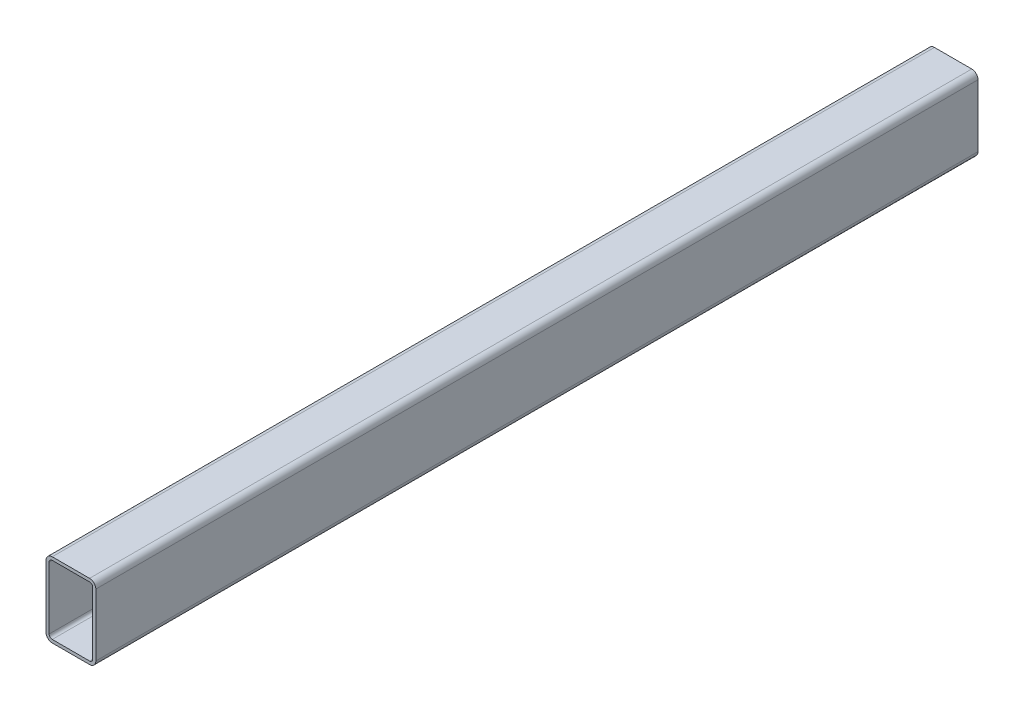
ISO-10303-21;
HEADER;
FILE_DESCRIPTION(('STEP AP214'),'2;1');
FILE_NAME('part.step','',(''),(''),'','','');
FILE_SCHEMA(('AUTOMOTIVE_DESIGN { 1 0 10303 214 1 1 1 1 }'));
ENDSEC;
DATA;
#1=APPLICATION_CONTEXT('core data for automotive mechanical design processes');
#2=APPLICATION_PROTOCOL_DEFINITION('international standard','automotive_design',2000,#1);
#3=PRODUCT_CONTEXT('',#1,'mechanical');
#4=PRODUCT('Part','Part','',(#3));
#5=PRODUCT_RELATED_PRODUCT_CATEGORY('part','',(#4));
#6=PRODUCT_DEFINITION_FORMATION('','',#4);
#7=PRODUCT_DEFINITION_CONTEXT('part definition',#1,'design');
#8=PRODUCT_DEFINITION('design','',#6,#7);
#9=PRODUCT_DEFINITION_SHAPE('','',#8);
#10=(LENGTH_UNIT() NAMED_UNIT(*) SI_UNIT(.MILLI.,.METRE.));
#11=(NAMED_UNIT(*) PLANE_ANGLE_UNIT() SI_UNIT($,.RADIAN.));
#12=(NAMED_UNIT(*) SI_UNIT($,.STERADIAN.) SOLID_ANGLE_UNIT());
#13=UNCERTAINTY_MEASURE_WITH_UNIT(LENGTH_MEASURE(1.E-05),#10,'distance_accuracy_value','');
#14=(GEOMETRIC_REPRESENTATION_CONTEXT(3) GLOBAL_UNCERTAINTY_ASSIGNED_CONTEXT((#13)) GLOBAL_UNIT_ASSIGNED_CONTEXT((#10,
#11,#12)) REPRESENTATION_CONTEXT('',''));
#15=CARTESIAN_POINT('',(0.,0.,0.));
#16=DIRECTION('',(0.,0.,1.));
#17=DIRECTION('',(1.,0.,0.));
#18=AXIS2_PLACEMENT_3D('',#15,#16,#17);
#19=CARTESIAN_POINT('',(-19.05,-31.75,-450.));
#20=DIRECTION('',(0.,0.,1.));
#21=DIRECTION('',(1.,0.,0.));
#22=AXIS2_PLACEMENT_3D('',#19,#20,#21);
#23=CYLINDRICAL_SURFACE('',#22,3.175);
#24=CARTESIAN_POINT('',(-19.05,-31.75,450.));
#25=DIRECTION('',(0.,0.,-1.));
#26=DIRECTION('',(-1.,0.,0.));
#27=AXIS2_PLACEMENT_3D('',#24,#25,#26);
#28=CIRCLE('',#27,3.175);
#29=CARTESIAN_POINT('',(-19.05,-34.925,450.));
#30=VERTEX_POINT('',#29);
#31=CARTESIAN_POINT('',(-22.2249999999999,-31.75,450.));
#32=VERTEX_POINT('',#31);
#33=EDGE_CURVE('E239',#30,#32,#28,.T.);
#34=ORIENTED_EDGE('',*,*,#33,.F.);
#35=DIRECTION('',(0.,0.,1.));
#36=VECTOR('',#35,1.);
#37=CARTESIAN_POINT('',(-19.05,-34.925,-450.));
#38=LINE('',#37,#36);
#39=CARTESIAN_POINT('',(-19.05,-34.925,-450.));
#40=VERTEX_POINT('',#39);
#41=EDGE_CURVE('E14',#40,#30,#38,.T.);
#42=ORIENTED_EDGE('',*,*,#41,.F.);
#43=CARTESIAN_POINT('',(-19.05,-31.75,-450.));
#44=DIRECTION('',(0.,0.,-1.));
#45=DIRECTION('',(-1.,0.,0.));
#46=AXIS2_PLACEMENT_3D('',#43,#44,#45);
#47=CIRCLE('',#46,3.175);
#48=CARTESIAN_POINT('',(-22.2249999999999,-31.75,-450.));
#49=VERTEX_POINT('',#48);
#50=EDGE_CURVE('E324',#40,#49,#47,.T.);
#51=ORIENTED_EDGE('',*,*,#50,.T.);
#52=DIRECTION('',(0.,0.,1.));
#53=VECTOR('',#52,1.);
#54=CARTESIAN_POINT('',(-22.2249999999999,-31.75,-450.));
#55=LINE('',#54,#53);
#56=EDGE_CURVE('E91',#49,#32,#55,.T.);
#57=ORIENTED_EDGE('',*,*,#56,.T.);
#58=EDGE_LOOP('',(#34,#42,#51,#57));
#59=FACE_BOUND('',#58,.T.);
#60=ADVANCED_FACE('F72',(#59),#23,.F.);
#61=CARTESIAN_POINT('',(-19.05,-34.925,-450.));
#62=DIRECTION('',(0.,1.,0.));
#63=DIRECTION('',(0.,0.,1.));
#64=AXIS2_PLACEMENT_3D('',#61,#62,#63);
#65=PLANE('',#64);
#66=DIRECTION('',(-1.,0.,0.));
#67=VECTOR('',#66,1.);
#68=CARTESIAN_POINT('',(-19.05,-34.925,450.));
#69=LINE('',#68,#67);
#70=CARTESIAN_POINT('',(19.05,-34.925,450.));
#71=VERTEX_POINT('',#70);
#72=EDGE_CURVE('E241',#71,#30,#69,.T.);
#73=ORIENTED_EDGE('',*,*,#72,.F.);
#74=DIRECTION('',(0.,0.,1.));
#75=VECTOR('',#74,1.);
#76=CARTESIAN_POINT('',(19.05,-34.925,-450.));
#77=LINE('',#76,#75);
#78=CARTESIAN_POINT('',(19.05,-34.925,-450.));
#79=VERTEX_POINT('',#78);
#80=EDGE_CURVE('E82',#79,#71,#77,.T.);
#81=ORIENTED_EDGE('',*,*,#80,.F.);
#82=DIRECTION('',(-1.,0.,0.));
#83=VECTOR('',#82,1.);
#84=CARTESIAN_POINT('',(-19.05,-34.925,-450.));
#85=LINE('',#84,#83);
#86=EDGE_CURVE('E326',#79,#40,#85,.T.);
#87=ORIENTED_EDGE('',*,*,#86,.T.);
#88=ORIENTED_EDGE('',*,*,#41,.T.);
#89=EDGE_LOOP('',(#73,#81,#87,#88));
#90=FACE_BOUND('',#89,.T.);
#91=ADVANCED_FACE('F353',(#90),#65,.T.);
#92=CARTESIAN_POINT('',(19.05,-31.75,-450.));
#93=DIRECTION('',(0.,0.,1.));
#94=DIRECTION('',(1.,0.,0.));
#95=AXIS2_PLACEMENT_3D('',#92,#93,#94);
#96=CYLINDRICAL_SURFACE('',#95,3.17499999999999);
#97=CARTESIAN_POINT('',(19.05,-31.75,450.));
#98=DIRECTION('',(0.,0.,-1.));
#99=DIRECTION('',(-1.,0.,0.));
#100=AXIS2_PLACEMENT_3D('',#97,#98,#99);
#101=CIRCLE('',#100,3.17499999999999);
#102=CARTESIAN_POINT('',(22.2250000000001,-31.75,450.));
#103=VERTEX_POINT('',#102);
#104=EDGE_CURVE('E244',#103,#71,#101,.T.);
#105=ORIENTED_EDGE('',*,*,#104,.F.);
#106=DIRECTION('',(0.,0.,1.));
#107=VECTOR('',#106,1.);
#108=CARTESIAN_POINT('',(22.2250000000001,-31.75,-450.));
#109=LINE('',#108,#107);
#110=CARTESIAN_POINT('',(22.2250000000001,-31.75,-450.));
#111=VERTEX_POINT('',#110);
#112=EDGE_CURVE('E265',#111,#103,#109,.T.);
#113=ORIENTED_EDGE('',*,*,#112,.F.);
#114=CARTESIAN_POINT('',(19.05,-31.75,-450.));
#115=DIRECTION('',(0.,0.,-1.));
#116=DIRECTION('',(-1.,0.,0.));
#117=AXIS2_PLACEMENT_3D('',#114,#115,#116);
#118=CIRCLE('',#117,3.17499999999999);
#119=EDGE_CURVE('E329',#111,#79,#118,.T.);
#120=ORIENTED_EDGE('',*,*,#119,.T.);
#121=ORIENTED_EDGE('',*,*,#80,.T.);
#122=EDGE_LOOP('',(#105,#113,#120,#121));
#123=FACE_BOUND('',#122,.T.);
#124=ADVANCED_FACE('F358',(#123),#96,.F.);
#125=CARTESIAN_POINT('',(22.2250000000001,31.75,-450.));
#126=DIRECTION('',(-1.,0.,0.));
#127=DIRECTION('',(0.,-1.,0.));
#128=AXIS2_PLACEMENT_3D('',#125,#126,#127);
#129=PLANE('',#128);
#130=DIRECTION('',(0.,-1.,0.));
#131=VECTOR('',#130,1.);
#132=CARTESIAN_POINT('',(22.2250000000001,31.75,450.));
#133=LINE('',#132,#131);
#134=CARTESIAN_POINT('',(22.2250000000001,31.75,450.));
#135=VERTEX_POINT('',#134);
#136=EDGE_CURVE('E247',#135,#103,#133,.T.);
#137=ORIENTED_EDGE('',*,*,#136,.F.);
#138=DIRECTION('',(0.,0.,1.));
#139=VECTOR('',#138,1.);
#140=CARTESIAN_POINT('',(22.2250000000001,31.75,-450.));
#141=LINE('',#140,#139);
#142=CARTESIAN_POINT('',(22.2250000000001,31.75,-450.));
#143=VERTEX_POINT('',#142);
#144=EDGE_CURVE('E263',#143,#135,#141,.T.);
#145=ORIENTED_EDGE('',*,*,#144,.F.);
#146=DIRECTION('',(0.,-1.,0.));
#147=VECTOR('',#146,1.);
#148=CARTESIAN_POINT('',(22.2250000000001,31.75,-450.));
#149=LINE('',#148,#147);
#150=EDGE_CURVE('E332',#143,#111,#149,.T.);
#151=ORIENTED_EDGE('',*,*,#150,.T.);
#152=ORIENTED_EDGE('',*,*,#112,.T.);
#153=EDGE_LOOP('',(#137,#145,#151,#152));
#154=FACE_BOUND('',#153,.T.);
#155=ADVANCED_FACE('F391',(#154),#129,.T.);
#156=CARTESIAN_POINT('',(19.05,31.75,-450.));
#157=DIRECTION('',(0.,0.,1.));
#158=DIRECTION('',(1.,0.,0.));
#159=AXIS2_PLACEMENT_3D('',#156,#157,#158);
#160=CYLINDRICAL_SURFACE('',#159,3.175);
#161=CARTESIAN_POINT('',(19.05,31.75,450.));
#162=DIRECTION('',(0.,0.,-1.));
#163=DIRECTION('',(1.,0.,0.));
#164=AXIS2_PLACEMENT_3D('',#161,#162,#163);
#165=CIRCLE('',#164,3.175);
#166=CARTESIAN_POINT('',(19.05,34.925,450.));
#167=VERTEX_POINT('',#166);
#168=EDGE_CURVE('E250',#167,#135,#165,.T.);
#169=ORIENTED_EDGE('',*,*,#168,.F.);
#170=DIRECTION('',(0.,0.,1.));
#171=VECTOR('',#170,1.);
#172=CARTESIAN_POINT('',(19.05,34.925,-450.));
#173=LINE('',#172,#171);
#174=CARTESIAN_POINT('',(19.05,34.925,-450.));
#175=VERTEX_POINT('',#174);
#176=EDGE_CURVE('E202',#175,#167,#173,.T.);
#177=ORIENTED_EDGE('',*,*,#176,.F.);
#178=CARTESIAN_POINT('',(19.05,31.75,-450.));
#179=DIRECTION('',(0.,0.,-1.));
#180=DIRECTION('',(1.,0.,0.));
#181=AXIS2_PLACEMENT_3D('',#178,#179,#180);
#182=CIRCLE('',#181,3.175);
#183=EDGE_CURVE('E213',#175,#143,#182,.T.);
#184=ORIENTED_EDGE('',*,*,#183,.T.);
#185=ORIENTED_EDGE('',*,*,#144,.T.);
#186=EDGE_LOOP('',(#169,#177,#184,#185));
#187=FACE_BOUND('',#186,.T.);
#188=ADVANCED_FACE('F336',(#187),#160,.F.);
#189=CARTESIAN_POINT('',(-19.05,34.925,-450.));
#190=DIRECTION('',(0.,-1.,0.));
#191=DIRECTION('',(0.,0.,-1.));
#192=AXIS2_PLACEMENT_3D('',#189,#190,#191);
#193=PLANE('',#192);
#194=DIRECTION('',(1.,0.,0.));
#195=VECTOR('',#194,1.);
#196=CARTESIAN_POINT('',(-19.05,34.925,450.));
#197=LINE('',#196,#195);
#198=CARTESIAN_POINT('',(-19.05,34.925,450.));
#199=VERTEX_POINT('',#198);
#200=EDGE_CURVE('E198',#199,#167,#197,.T.);
#201=ORIENTED_EDGE('',*,*,#200,.F.);
#202=DIRECTION('',(0.,0.,1.));
#203=VECTOR('',#202,1.);
#204=CARTESIAN_POINT('',(-19.05,34.925,-450.));
#205=LINE('',#204,#203);
#206=CARTESIAN_POINT('',(-19.05,34.925,-450.));
#207=VERTEX_POINT('',#206);
#208=EDGE_CURVE('E193',#207,#199,#205,.T.);
#209=ORIENTED_EDGE('',*,*,#208,.F.);
#210=DIRECTION('',(1.,0.,0.));
#211=VECTOR('',#210,1.);
#212=CARTESIAN_POINT('',(-19.05,34.925,-450.));
#213=LINE('',#212,#211);
#214=EDGE_CURVE('E196',#207,#175,#213,.T.);
#215=ORIENTED_EDGE('',*,*,#214,.T.);
#216=ORIENTED_EDGE('',*,*,#176,.T.);
#217=EDGE_LOOP('',(#201,#209,#215,#216));
#218=FACE_BOUND('',#217,.T.);
#219=ADVANCED_FACE('F195',(#218),#193,.T.);
#220=CARTESIAN_POINT('',(-19.05,31.75,-450.));
#221=DIRECTION('',(0.,0.,1.));
#222=DIRECTION('',(1.,0.,0.));
#223=AXIS2_PLACEMENT_3D('',#220,#221,#222);
#224=CYLINDRICAL_SURFACE('',#223,3.175);
#225=CARTESIAN_POINT('',(-19.05,31.75,450.));
#226=DIRECTION('',(0.,0.,-1.));
#227=DIRECTION('',(-1.,0.,0.));
#228=AXIS2_PLACEMENT_3D('',#225,#226,#227);
#229=CIRCLE('',#228,3.175);
#230=CARTESIAN_POINT('',(-22.2249999999999,31.75,450.));
#231=VERTEX_POINT('',#230);
#232=EDGE_CURVE('E254',#231,#199,#229,.T.);
#233=ORIENTED_EDGE('',*,*,#232,.F.);
#234=DIRECTION('',(0.,0.,1.));
#235=VECTOR('',#234,1.);
#236=CARTESIAN_POINT('',(-22.2249999999999,31.75,-450.));
#237=LINE('',#236,#235);
#238=CARTESIAN_POINT('',(-22.2249999999999,31.75,-450.));
#239=VERTEX_POINT('',#238);
#240=EDGE_CURVE('E140',#239,#231,#237,.T.);
#241=ORIENTED_EDGE('',*,*,#240,.F.);
#242=CARTESIAN_POINT('',(-19.05,31.75,-450.));
#243=DIRECTION('',(0.,0.,-1.));
#244=DIRECTION('',(-1.,0.,0.));
#245=AXIS2_PLACEMENT_3D('',#242,#243,#244);
#246=CIRCLE('',#245,3.175);
#247=EDGE_CURVE('E210',#239,#207,#246,.T.);
#248=ORIENTED_EDGE('',*,*,#247,.T.);
#249=ORIENTED_EDGE('',*,*,#208,.T.);
#250=EDGE_LOOP('',(#233,#241,#248,#249));
#251=FACE_BOUND('',#250,.T.);
#252=ADVANCED_FACE('F215',(#251),#224,.F.);
#253=CARTESIAN_POINT('',(-19.05,-31.75,-450.));
#254=DIRECTION('',(0.,0.,1.));
#255=DIRECTION('',(1.,0.,0.));
#256=AXIS2_PLACEMENT_3D('',#253,#254,#255);
#257=CYLINDRICAL_SURFACE('',#256,6.35000000000001);
#258=CARTESIAN_POINT('',(-19.05,-31.75,450.));
#259=DIRECTION('',(0.,0.,-1.));
#260=DIRECTION('',(1.,0.,0.));
#261=AXIS2_PLACEMENT_3D('',#258,#259,#260);
#262=CIRCLE('',#261,6.35000000000001);
#263=CARTESIAN_POINT('',(-19.05,-38.1,450.));
#264=VERTEX_POINT('',#263);
#265=CARTESIAN_POINT('',(-25.4,-31.75,450.));
#266=VERTEX_POINT('',#265);
#267=EDGE_CURVE('E222',#264,#266,#262,.T.);
#268=ORIENTED_EDGE('',*,*,#267,.T.);
#269=DIRECTION('',(0.,0.,1.));
#270=VECTOR('',#269,1.);
#271=CARTESIAN_POINT('',(-25.4,-31.75,-450.));
#272=LINE('',#271,#270);
#273=CARTESIAN_POINT('',(-25.4,-31.75,-450.));
#274=VERTEX_POINT('',#273);
#275=EDGE_CURVE('E76',#274,#266,#272,.T.);
#276=ORIENTED_EDGE('',*,*,#275,.F.);
#277=CARTESIAN_POINT('',(-19.05,-31.75,-450.));
#278=DIRECTION('',(0.,0.,-1.));
#279=DIRECTION('',(1.,0.,0.));
#280=AXIS2_PLACEMENT_3D('',#277,#278,#279);
#281=CIRCLE('',#280,6.35000000000001);
#282=CARTESIAN_POINT('',(-19.05,-38.1,-450.));
#283=VERTEX_POINT('',#282);
#284=EDGE_CURVE('E259',#283,#274,#281,.T.);
#285=ORIENTED_EDGE('',*,*,#284,.F.);
#286=DIRECTION('',(0.,0.,1.));
#287=VECTOR('',#286,1.);
#288=CARTESIAN_POINT('',(-19.05,-38.1,-450.));
#289=LINE('',#288,#287);
#290=EDGE_CURVE('E218',#283,#264,#289,.T.);
#291=ORIENTED_EDGE('',*,*,#290,.T.);
#292=EDGE_LOOP('',(#268,#276,#285,#291));
#293=FACE_BOUND('',#292,.T.);
#294=ADVANCED_FACE('F74',(#293),#257,.T.);
#295=CARTESIAN_POINT('',(-25.4,31.75,-450.));
#296=DIRECTION('',(1.,0.,0.));
#297=DIRECTION('',(0.,1.,0.));
#298=AXIS2_PLACEMENT_3D('',#295,#296,#297);
#299=PLANE('',#298);
#300=DIRECTION('',(0.,1.,0.));
#301=VECTOR('',#300,1.);
#302=CARTESIAN_POINT('',(-25.4,31.75,450.));
#303=LINE('',#302,#301);
#304=CARTESIAN_POINT('',(-25.4,31.75,450.));
#305=VERTEX_POINT('',#304);
#306=EDGE_CURVE('E225',#266,#305,#303,.T.);
#307=ORIENTED_EDGE('',*,*,#306,.T.);
#308=DIRECTION('',(0.,0.,1.));
#309=VECTOR('',#308,1.);
#310=CARTESIAN_POINT('',(-25.4,31.75,-450.));
#311=LINE('',#310,#309);
#312=CARTESIAN_POINT('',(-25.4,31.75,-450.));
#313=VERTEX_POINT('',#312);
#314=EDGE_CURVE('E284',#313,#305,#311,.T.);
#315=ORIENTED_EDGE('',*,*,#314,.F.);
#316=DIRECTION('',(0.,1.,0.));
#317=VECTOR('',#316,1.);
#318=CARTESIAN_POINT('',(-25.4,31.75,-450.));
#319=LINE('',#318,#317);
#320=EDGE_CURVE('E153',#274,#313,#319,.T.);
#321=ORIENTED_EDGE('',*,*,#320,.F.);
#322=ORIENTED_EDGE('',*,*,#275,.T.);
#323=EDGE_LOOP('',(#307,#315,#321,#322));
#324=FACE_BOUND('',#323,.T.);
#325=ADVANCED_FACE('F290',(#324),#299,.F.);
#326=CARTESIAN_POINT('',(-19.05,31.75,-450.));
#327=DIRECTION('',(0.,0.,1.));
#328=DIRECTION('',(1.,0.,0.));
#329=AXIS2_PLACEMENT_3D('',#326,#327,#328);
#330=CYLINDRICAL_SURFACE('',#329,6.35);
#331=CARTESIAN_POINT('',(-19.05,31.75,450.));
#332=DIRECTION('',(0.,0.,-1.));
#333=DIRECTION('',(-1.,0.,0.));
#334=AXIS2_PLACEMENT_3D('',#331,#332,#333);
#335=CIRCLE('',#334,6.35);
#336=CARTESIAN_POINT('',(-19.05,38.1,450.));
#337=VERTEX_POINT('',#336);
#338=EDGE_CURVE('E227',#305,#337,#335,.T.);
#339=ORIENTED_EDGE('',*,*,#338,.T.);
#340=DIRECTION('',(0.,0.,1.));
#341=VECTOR('',#340,1.);
#342=CARTESIAN_POINT('',(-19.05,38.1,-450.));
#343=LINE('',#342,#341);
#344=CARTESIAN_POINT('',(-19.05,38.1,-450.));
#345=VERTEX_POINT('',#344);
#346=EDGE_CURVE('E282',#345,#337,#343,.T.);
#347=ORIENTED_EDGE('',*,*,#346,.F.);
#348=CARTESIAN_POINT('',(-19.05,31.75,-450.));
#349=DIRECTION('',(0.,0.,-1.));
#350=DIRECTION('',(-1.,0.,0.));
#351=AXIS2_PLACEMENT_3D('',#348,#349,#350);
#352=CIRCLE('',#351,6.35);
#353=EDGE_CURVE('E312',#313,#345,#352,.T.);
#354=ORIENTED_EDGE('',*,*,#353,.F.);
#355=ORIENTED_EDGE('',*,*,#314,.T.);
#356=EDGE_LOOP('',(#339,#347,#354,#355));
#357=FACE_BOUND('',#356,.T.);
#358=ADVANCED_FACE('F303',(#357),#330,.T.);
#359=CARTESIAN_POINT('',(-19.05,38.1,-450.));
#360=DIRECTION('',(0.,-1.,0.));
#361=DIRECTION('',(0.,0.,-1.));
#362=AXIS2_PLACEMENT_3D('',#359,#360,#361);
#363=PLANE('',#362);
#364=DIRECTION('',(1.,0.,0.));
#365=VECTOR('',#364,1.);
#366=CARTESIAN_POINT('',(-19.05,38.1,450.));
#367=LINE('',#366,#365);
#368=CARTESIAN_POINT('',(19.05,38.1,450.));
#369=VERTEX_POINT('',#368);
#370=EDGE_CURVE('E229',#337,#369,#367,.T.);
#371=ORIENTED_EDGE('',*,*,#370,.T.);
#372=DIRECTION('',(0.,0.,1.));
#373=VECTOR('',#372,1.);
#374=CARTESIAN_POINT('',(19.05,38.1,-450.));
#375=LINE('',#374,#373);
#376=CARTESIAN_POINT('',(19.05,38.1,-450.));
#377=VERTEX_POINT('',#376);
#378=EDGE_CURVE('E279',#377,#369,#375,.T.);
#379=ORIENTED_EDGE('',*,*,#378,.F.);
#380=DIRECTION('',(1.,0.,0.));
#381=VECTOR('',#380,1.);
#382=CARTESIAN_POINT('',(-19.05,38.1,-450.));
#383=LINE('',#382,#381);
#384=EDGE_CURVE('E308',#345,#377,#383,.T.);
#385=ORIENTED_EDGE('',*,*,#384,.F.);
#386=ORIENTED_EDGE('',*,*,#346,.T.);
#387=EDGE_LOOP('',(#371,#379,#385,#386));
#388=FACE_BOUND('',#387,.T.);
#389=ADVANCED_FACE('F306',(#388),#363,.F.);
#390=CARTESIAN_POINT('',(19.05,31.75,-450.));
#391=DIRECTION('',(0.,0.,1.));
#392=DIRECTION('',(1.,0.,0.));
#393=AXIS2_PLACEMENT_3D('',#390,#391,#392);
#394=CYLINDRICAL_SURFACE('',#393,6.35);
#395=CARTESIAN_POINT('',(19.05,31.75,450.));
#396=DIRECTION('',(0.,0.,-1.));
#397=DIRECTION('',(-1.,0.,0.));
#398=AXIS2_PLACEMENT_3D('',#395,#396,#397);
#399=CIRCLE('',#398,6.35);
#400=CARTESIAN_POINT('',(25.4,31.75,450.));
#401=VERTEX_POINT('',#400);
#402=EDGE_CURVE('E231',#369,#401,#399,.T.);
#403=ORIENTED_EDGE('',*,*,#402,.T.);
#404=DIRECTION('',(0.,0.,1.));
#405=VECTOR('',#404,1.);
#406=CARTESIAN_POINT('',(25.4,31.75,-450.));
#407=LINE('',#406,#405);
#408=CARTESIAN_POINT('',(25.4,31.75,-450.));
#409=VERTEX_POINT('',#408);
#410=EDGE_CURVE('E276',#409,#401,#407,.T.);
#411=ORIENTED_EDGE('',*,*,#410,.F.);
#412=CARTESIAN_POINT('',(19.05,31.75,-450.));
#413=DIRECTION('',(0.,0.,-1.));
#414=DIRECTION('',(-1.,0.,0.));
#415=AXIS2_PLACEMENT_3D('',#412,#413,#414);
#416=CIRCLE('',#415,6.35);
#417=EDGE_CURVE('E311',#377,#409,#416,.T.);
#418=ORIENTED_EDGE('',*,*,#417,.F.);
#419=ORIENTED_EDGE('',*,*,#378,.T.);
#420=EDGE_LOOP('',(#403,#411,#418,#419));
#421=FACE_BOUND('',#420,.T.);
#422=ADVANCED_FACE('F369',(#421),#394,.T.);
#423=CARTESIAN_POINT('',(25.4,31.75,-450.));
#424=DIRECTION('',(-1.,0.,0.));
#425=DIRECTION('',(0.,-1.,0.));
#426=AXIS2_PLACEMENT_3D('',#423,#424,#425);
#427=PLANE('',#426);
#428=DIRECTION('',(0.,-1.,0.));
#429=VECTOR('',#428,1.);
#430=CARTESIAN_POINT('',(25.4,31.75,450.));
#431=LINE('',#430,#429);
#432=CARTESIAN_POINT('',(25.4,-31.75,450.));
#433=VERTEX_POINT('',#432);
#434=EDGE_CURVE('E233',#401,#433,#431,.T.);
#435=ORIENTED_EDGE('',*,*,#434,.T.);
#436=DIRECTION('',(0.,0.,1.));
#437=VECTOR('',#436,1.);
#438=CARTESIAN_POINT('',(25.4,-31.75,-450.));
#439=LINE('',#438,#437);
#440=CARTESIAN_POINT('',(25.4,-31.75,-450.));
#441=VERTEX_POINT('',#440);
#442=EDGE_CURVE('E273',#441,#433,#439,.T.);
#443=ORIENTED_EDGE('',*,*,#442,.F.);
#444=DIRECTION('',(0.,-1.,0.));
#445=VECTOR('',#444,1.);
#446=CARTESIAN_POINT('',(25.4,31.75,-450.));
#447=LINE('',#446,#445);
#448=EDGE_CURVE('E314',#409,#441,#447,.T.);
#449=ORIENTED_EDGE('',*,*,#448,.F.);
#450=ORIENTED_EDGE('',*,*,#410,.T.);
#451=EDGE_LOOP('',(#435,#443,#449,#450));
#452=FACE_BOUND('',#451,.T.);
#453=ADVANCED_FACE('F365',(#452),#427,.F.);
#454=CARTESIAN_POINT('',(19.05,-31.75,-450.));
#455=DIRECTION('',(0.,0.,1.));
#456=DIRECTION('',(1.,0.,0.));
#457=AXIS2_PLACEMENT_3D('',#454,#455,#456);
#458=CYLINDRICAL_SURFACE('',#457,6.35000000000001);
#459=CARTESIAN_POINT('',(19.05,-31.75,450.));
#460=DIRECTION('',(0.,0.,-1.));
#461=DIRECTION('',(-1.,0.,0.));
#462=AXIS2_PLACEMENT_3D('',#459,#460,#461);
#463=CIRCLE('',#462,6.35000000000001);
#464=CARTESIAN_POINT('',(19.05,-38.1,450.));
#465=VERTEX_POINT('',#464);
#466=EDGE_CURVE('E235',#433,#465,#463,.T.);
#467=ORIENTED_EDGE('',*,*,#466,.T.);
#468=DIRECTION('',(0.,0.,1.));
#469=VECTOR('',#468,1.);
#470=CARTESIAN_POINT('',(19.05,-38.1,-450.));
#471=LINE('',#470,#469);
#472=CARTESIAN_POINT('',(19.05,-38.1,-450.));
#473=VERTEX_POINT('',#472);
#474=EDGE_CURVE('E270',#473,#465,#471,.T.);
#475=ORIENTED_EDGE('',*,*,#474,.F.);
#476=CARTESIAN_POINT('',(19.05,-31.75,-450.));
#477=DIRECTION('',(0.,0.,-1.));
#478=DIRECTION('',(-1.,0.,0.));
#479=AXIS2_PLACEMENT_3D('',#476,#477,#478);
#480=CIRCLE('',#479,6.35000000000001);
#481=EDGE_CURVE('E320',#441,#473,#480,.T.);
#482=ORIENTED_EDGE('',*,*,#481,.F.);
#483=ORIENTED_EDGE('',*,*,#442,.T.);
#484=EDGE_LOOP('',(#467,#475,#482,#483));
#485=FACE_BOUND('',#484,.T.);
#486=ADVANCED_FACE('F347',(#485),#458,.T.);
#487=CARTESIAN_POINT('',(-19.05,-38.1,-450.));
#488=DIRECTION('',(0.,1.,0.));
#489=DIRECTION('',(0.,0.,1.));
#490=AXIS2_PLACEMENT_3D('',#487,#488,#489);
#491=PLANE('',#490);
#492=DIRECTION('',(-1.,0.,0.));
#493=VECTOR('',#492,1.);
#494=CARTESIAN_POINT('',(-19.05,-38.1,450.));
#495=LINE('',#494,#493);
#496=EDGE_CURVE('E237',#465,#264,#495,.T.);
#497=ORIENTED_EDGE('',*,*,#496,.T.);
#498=ORIENTED_EDGE('',*,*,#290,.F.);
#499=DIRECTION('',(-1.,0.,0.));
#500=VECTOR('',#499,1.);
#501=CARTESIAN_POINT('',(-19.05,-38.1,-450.));
#502=LINE('',#501,#500);
#503=EDGE_CURVE('E322',#473,#283,#502,.T.);
#504=ORIENTED_EDGE('',*,*,#503,.F.);
#505=ORIENTED_EDGE('',*,*,#474,.T.);
#506=EDGE_LOOP('',(#497,#498,#504,#505));
#507=FACE_BOUND('',#506,.T.);
#508=ADVANCED_FACE('F340',(#507),#491,.F.);
#509=CARTESIAN_POINT('',(-22.2249999999999,31.75,-450.));
#510=DIRECTION('',(1.,0.,0.));
#511=DIRECTION('',(0.,1.,0.));
#512=AXIS2_PLACEMENT_3D('',#509,#510,#511);
#513=PLANE('',#512);
#514=DIRECTION('',(0.,1.,0.));
#515=VECTOR('',#514,1.);
#516=CARTESIAN_POINT('',(-22.2249999999999,31.75,450.));
#517=LINE('',#516,#515);
#518=EDGE_CURVE('E256',#32,#231,#517,.T.);
#519=ORIENTED_EDGE('',*,*,#518,.F.);
#520=ORIENTED_EDGE('',*,*,#56,.F.);
#521=DIRECTION('',(0.,1.,0.));
#522=VECTOR('',#521,1.);
#523=CARTESIAN_POINT('',(-22.2249999999999,31.75,-450.));
#524=LINE('',#523,#522);
#525=EDGE_CURVE('E216',#49,#239,#524,.T.);
#526=ORIENTED_EDGE('',*,*,#525,.T.);
#527=ORIENTED_EDGE('',*,*,#240,.T.);
#528=EDGE_LOOP('',(#519,#520,#526,#527));
#529=FACE_BOUND('',#528,.T.);
#530=ADVANCED_FACE('F338',(#529),#513,.T.);
#531=CARTESIAN_POINT('',(-19.05,-31.75,-450.));
#532=DIRECTION('',(0.,0.,1.));
#533=DIRECTION('',(1.,0.,0.));
#534=AXIS2_PLACEMENT_3D('',#531,#532,#533);
#535=PLANE('',#534);
#536=ORIENTED_EDGE('',*,*,#284,.T.);
#537=ORIENTED_EDGE('',*,*,#320,.T.);
#538=ORIENTED_EDGE('',*,*,#353,.T.);
#539=ORIENTED_EDGE('',*,*,#384,.T.);
#540=ORIENTED_EDGE('',*,*,#417,.T.);
#541=ORIENTED_EDGE('',*,*,#448,.T.);
#542=ORIENTED_EDGE('',*,*,#481,.T.);
#543=ORIENTED_EDGE('',*,*,#503,.T.);
#544=EDGE_LOOP('',(#536,#537,#538,#539,#540,#541,#542,#543));
#545=FACE_BOUND('',#544,.T.);
#546=ORIENTED_EDGE('',*,*,#50,.F.);
#547=ORIENTED_EDGE('',*,*,#86,.F.);
#548=ORIENTED_EDGE('',*,*,#119,.F.);
#549=ORIENTED_EDGE('',*,*,#150,.F.);
#550=ORIENTED_EDGE('',*,*,#183,.F.);
#551=ORIENTED_EDGE('',*,*,#214,.F.);
#552=ORIENTED_EDGE('',*,*,#247,.F.);
#553=ORIENTED_EDGE('',*,*,#525,.F.);
#554=EDGE_LOOP('',(#546,#547,#548,#549,#550,#551,#552,#553));
#555=FACE_BOUND('',#554,.T.);
#556=ADVANCED_FACE('F208',(#545,#555),#535,.F.);
#557=CARTESIAN_POINT('',(-19.05,-31.75,450.));
#558=DIRECTION('',(0.,0.,1.));
#559=DIRECTION('',(1.,0.,0.));
#560=AXIS2_PLACEMENT_3D('',#557,#558,#559);
#561=PLANE('',#560);
#562=ORIENTED_EDGE('',*,*,#267,.F.);
#563=ORIENTED_EDGE('',*,*,#496,.F.);
#564=ORIENTED_EDGE('',*,*,#466,.F.);
#565=ORIENTED_EDGE('',*,*,#434,.F.);
#566=ORIENTED_EDGE('',*,*,#402,.F.);
#567=ORIENTED_EDGE('',*,*,#370,.F.);
#568=ORIENTED_EDGE('',*,*,#338,.F.);
#569=ORIENTED_EDGE('',*,*,#306,.F.);
#570=EDGE_LOOP('',(#562,#563,#564,#565,#566,#567,#568,#569));
#571=FACE_BOUND('',#570,.T.);
#572=ORIENTED_EDGE('',*,*,#33,.T.);
#573=ORIENTED_EDGE('',*,*,#518,.T.);
#574=ORIENTED_EDGE('',*,*,#232,.T.);
#575=ORIENTED_EDGE('',*,*,#200,.T.);
#576=ORIENTED_EDGE('',*,*,#168,.T.);
#577=ORIENTED_EDGE('',*,*,#136,.T.);
#578=ORIENTED_EDGE('',*,*,#104,.T.);
#579=ORIENTED_EDGE('',*,*,#72,.T.);
#580=EDGE_LOOP('',(#572,#573,#574,#575,#576,#577,#578,#579));
#581=FACE_BOUND('',#580,.T.);
#582=ADVANCED_FACE('F297',(#571,#581),#561,.T.);
#583=CLOSED_SHELL('',(#60,#91,#124,#155,#188,#219,#252,#294,#325,#358,#389,#422,#453,#486,#508,
#530,#556,#582));
#584=MANIFOLD_SOLID_BREP('B2',#583);
#585=ADVANCED_BREP_SHAPE_REPRESENTATION('',(#18,#584),#14);
#586=SHAPE_DEFINITION_REPRESENTATION(#9,#585);
ENDSEC;
END-ISO-10303-21;
